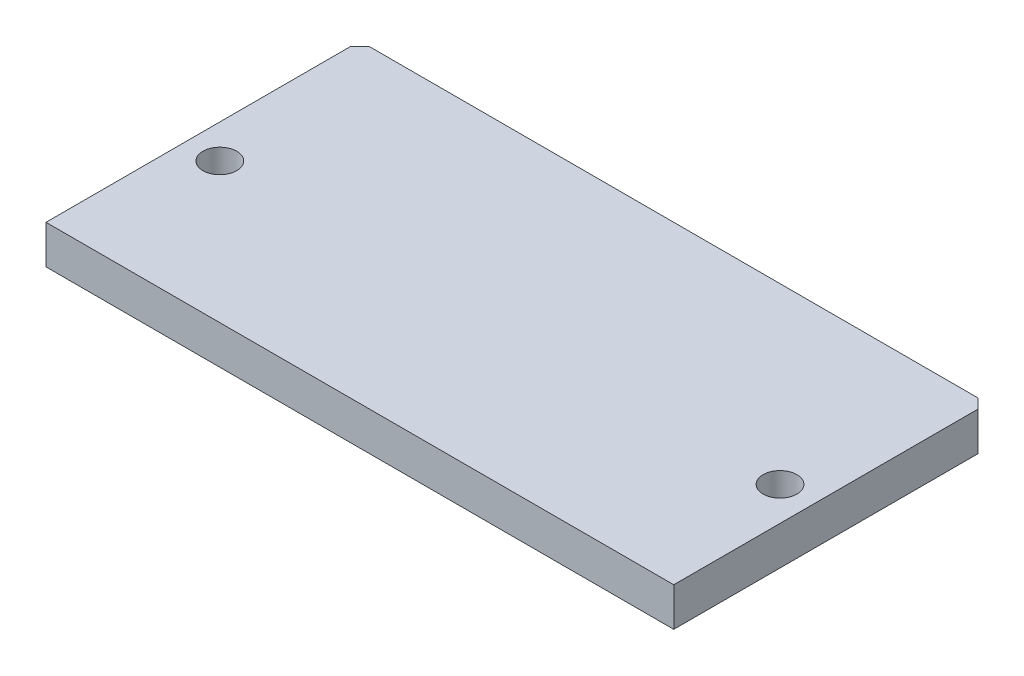
ISO-10303-21;
HEADER;
FILE_DESCRIPTION(('STEP AP214'),'2;1');
FILE_NAME('part.step','',(''),(''),'','','');
FILE_SCHEMA(('AUTOMOTIVE_DESIGN { 1 0 10303 214 1 1 1 1 }'));
ENDSEC;
DATA;
#1=APPLICATION_CONTEXT('core data for automotive mechanical design processes');
#2=APPLICATION_PROTOCOL_DEFINITION('international standard','automotive_design',2000,#1);
#3=PRODUCT_CONTEXT('',#1,'mechanical');
#4=PRODUCT('Part','Part','',(#3));
#5=PRODUCT_RELATED_PRODUCT_CATEGORY('part','',(#4));
#6=PRODUCT_DEFINITION_FORMATION('','',#4);
#7=PRODUCT_DEFINITION_CONTEXT('part definition',#1,'design');
#8=PRODUCT_DEFINITION('design','',#6,#7);
#9=PRODUCT_DEFINITION_SHAPE('','',#8);
#10=(LENGTH_UNIT() NAMED_UNIT(*) SI_UNIT(.MILLI.,.METRE.));
#11=(NAMED_UNIT(*) PLANE_ANGLE_UNIT() SI_UNIT($,.RADIAN.));
#12=(NAMED_UNIT(*) SI_UNIT($,.STERADIAN.) SOLID_ANGLE_UNIT());
#13=UNCERTAINTY_MEASURE_WITH_UNIT(LENGTH_MEASURE(1.E-05),#10,'distance_accuracy_value','');
#14=(GEOMETRIC_REPRESENTATION_CONTEXT(3) GLOBAL_UNCERTAINTY_ASSIGNED_CONTEXT((#13)) GLOBAL_UNIT_ASSIGNED_CONTEXT((#10,
#11,#12)) REPRESENTATION_CONTEXT('',''));
#15=CARTESIAN_POINT('',(0.,0.,0.));
#16=DIRECTION('',(0.,0.,1.));
#17=DIRECTION('',(1.,0.,0.));
#18=AXIS2_PLACEMENT_3D('',#15,#16,#17);
#19=CARTESIAN_POINT('',(31.5,4.,-16.25));
#20=DIRECTION('',(-0.70710678118655,0.,0.707106781186545));
#21=DIRECTION('',(0.,1.,0.));
#22=AXIS2_PLACEMENT_3D('',#19,#20,#21);
#23=PLANE('',#22);
#24=DIRECTION('',(-0.707106781186545,0.,-0.70710678118655));
#25=VECTOR('',#24,1.);
#26=CARTESIAN_POINT('',(23.875,4.,-23.875));
#27=LINE('',#26,#25);
#28=CARTESIAN_POINT('',(32.5,4.,-15.25));
#29=VERTEX_POINT('',#28);
#30=CARTESIAN_POINT('',(31.5,4.,-16.25));
#31=VERTEX_POINT('',#30);
#32=EDGE_CURVE('E101',#29,#31,#27,.T.);
#33=ORIENTED_EDGE('',*,*,#32,.F.);
#34=DIRECTION('',(0.,1.,0.));
#35=VECTOR('',#34,1.);
#36=CARTESIAN_POINT('',(32.5,4.,-15.25));
#37=LINE('',#36,#35);
#38=CARTESIAN_POINT('',(32.5,0.,-15.25));
#39=VERTEX_POINT('',#38);
#40=EDGE_CURVE('E128',#39,#29,#37,.T.);
#41=ORIENTED_EDGE('',*,*,#40,.F.);
#42=DIRECTION('',(0.707106781186545,0.,0.70710678118655));
#43=VECTOR('',#42,1.);
#44=CARTESIAN_POINT('',(31.5,0.,-16.25));
#45=LINE('',#44,#43);
#46=CARTESIAN_POINT('',(31.5,0.,-16.25));
#47=VERTEX_POINT('',#46);
#48=EDGE_CURVE('E90',#47,#39,#45,.T.);
#49=ORIENTED_EDGE('',*,*,#48,.F.);
#50=DIRECTION('',(0.,-1.,0.));
#51=VECTOR('',#50,1.);
#52=CARTESIAN_POINT('',(31.5,4.,-16.25));
#53=LINE('',#52,#51);
#54=EDGE_CURVE('E107',#31,#47,#53,.T.);
#55=ORIENTED_EDGE('',*,*,#54,.F.);
#56=EDGE_LOOP('',(#33,#41,#49,#55));
#57=FACE_BOUND('',#56,.T.);
#58=ADVANCED_FACE('F17',(#57),#23,.F.);
#59=CARTESIAN_POINT('',(-32.5,4.,-15.25));
#60=DIRECTION('',(0.70710678118655,0.,0.707106781186545));
#61=DIRECTION('',(0.,-1.,0.));
#62=AXIS2_PLACEMENT_3D('',#59,#60,#61);
#63=PLANE('',#62);
#64=DIRECTION('',(-0.707106781186545,0.,0.70710678118655));
#65=VECTOR('',#64,1.);
#66=CARTESIAN_POINT('',(-23.875,4.,-23.875));
#67=LINE('',#66,#65);
#68=CARTESIAN_POINT('',(-31.5,4.,-16.25));
#69=VERTEX_POINT('',#68);
#70=CARTESIAN_POINT('',(-32.5,4.,-15.25));
#71=VERTEX_POINT('',#70);
#72=EDGE_CURVE('E103',#69,#71,#67,.T.);
#73=ORIENTED_EDGE('',*,*,#72,.F.);
#74=DIRECTION('',(0.,1.,0.));
#75=VECTOR('',#74,1.);
#76=CARTESIAN_POINT('',(-31.5,4.,-16.25));
#77=LINE('',#76,#75);
#78=CARTESIAN_POINT('',(-31.5,0.,-16.25));
#79=VERTEX_POINT('',#78);
#80=EDGE_CURVE('E115',#79,#69,#77,.T.);
#81=ORIENTED_EDGE('',*,*,#80,.F.);
#82=DIRECTION('',(0.707106781186545,0.,-0.70710678118655));
#83=VECTOR('',#82,1.);
#84=CARTESIAN_POINT('',(-32.5,0.,-15.25));
#85=LINE('',#84,#83);
#86=CARTESIAN_POINT('',(-32.5,0.,-15.25));
#87=VERTEX_POINT('',#86);
#88=EDGE_CURVE('E95',#87,#79,#85,.T.);
#89=ORIENTED_EDGE('',*,*,#88,.F.);
#90=DIRECTION('',(0.,-1.,0.));
#91=VECTOR('',#90,1.);
#92=CARTESIAN_POINT('',(-32.5,4.,-15.25));
#93=LINE('',#92,#91);
#94=EDGE_CURVE('E154',#71,#87,#93,.T.);
#95=ORIENTED_EDGE('',*,*,#94,.F.);
#96=EDGE_LOOP('',(#73,#81,#89,#95));
#97=FACE_BOUND('',#96,.T.);
#98=ADVANCED_FACE('F19',(#97),#63,.F.);
#99=CARTESIAN_POINT('',(-29.,0.,1.75));
#100=DIRECTION('',(0.,-1.,0.));
#101=DIRECTION('',(0.,0.,-1.));
#102=AXIS2_PLACEMENT_3D('',#99,#100,#101);
#103=CONICAL_SURFACE('',#102,3.,0.785398163397448);
#104=CARTESIAN_POINT('',(-29.,1.24999999999999,1.75));
#105=DIRECTION('',(0.,-1.,0.));
#106=DIRECTION('',(0.,0.,-1.));
#107=AXIS2_PLACEMENT_3D('',#104,#105,#106);
#108=CIRCLE('',#107,1.75);
#109=CARTESIAN_POINT('',(-29.,1.24999999999999,0.));
#110=VERTEX_POINT('',#109);
#111=EDGE_CURVE('E11',#110,#110,#108,.T.);
#112=ORIENTED_EDGE('',*,*,#111,.F.);
#113=EDGE_LOOP('',(#112));
#114=FACE_BOUND('',#113,.T.);
#115=CARTESIAN_POINT('',(-29.,0.,1.75));
#116=DIRECTION('',(0.,-1.,0.));
#117=DIRECTION('',(0.,0.,-1.));
#118=AXIS2_PLACEMENT_3D('',#115,#116,#117);
#119=CIRCLE('',#118,3.);
#120=CARTESIAN_POINT('',(-29.,0.,-1.25));
#121=VERTEX_POINT('',#120);
#122=EDGE_CURVE('E83',#121,#121,#119,.T.);
#123=ORIENTED_EDGE('',*,*,#122,.T.);
#124=EDGE_LOOP('',(#123));
#125=FACE_BOUND('',#124,.T.);
#126=ADVANCED_FACE('F223',(#114,#125),#103,.F.);
#127=CARTESIAN_POINT('',(-29.,0.,1.75));
#128=DIRECTION('',(0.,-1.,0.));
#129=DIRECTION('',(0.,0.,-1.));
#130=AXIS2_PLACEMENT_3D('',#127,#128,#129);
#131=CYLINDRICAL_SURFACE('',#130,1.75);
#132=CARTESIAN_POINT('',(-29.,4.,1.75));
#133=DIRECTION('',(0.,1.,0.));
#134=DIRECTION('',(0.,0.,1.));
#135=AXIS2_PLACEMENT_3D('',#132,#133,#134);
#136=CIRCLE('',#135,1.75);
#137=CARTESIAN_POINT('',(-29.,4.,3.5));
#138=VERTEX_POINT('',#137);
#139=EDGE_CURVE('E99',#138,#138,#136,.T.);
#140=ORIENTED_EDGE('',*,*,#139,.T.);
#141=EDGE_LOOP('',(#140));
#142=FACE_BOUND('',#141,.T.);
#143=ORIENTED_EDGE('',*,*,#111,.T.);
#144=EDGE_LOOP('',(#143));
#145=FACE_BOUND('',#144,.T.);
#146=ADVANCED_FACE('F230',(#142,#145),#131,.F.);
#147=CARTESIAN_POINT('',(29.,0.,1.75));
#148=DIRECTION('',(0.,-1.,0.));
#149=DIRECTION('',(0.,0.,-1.));
#150=AXIS2_PLACEMENT_3D('',#147,#148,#149);
#151=CONICAL_SURFACE('',#150,3.,0.785398163397448);
#152=CARTESIAN_POINT('',(29.,1.24999999999999,1.75));
#153=DIRECTION('',(0.,-1.,0.));
#154=DIRECTION('',(0.,0.,-1.));
#155=AXIS2_PLACEMENT_3D('',#152,#153,#154);
#156=CIRCLE('',#155,1.75);
#157=CARTESIAN_POINT('',(29.,1.24999999999999,0.));
#158=VERTEX_POINT('',#157);
#159=EDGE_CURVE('E27',#158,#158,#156,.T.);
#160=ORIENTED_EDGE('',*,*,#159,.F.);
#161=EDGE_LOOP('',(#160));
#162=FACE_BOUND('',#161,.T.);
#163=CARTESIAN_POINT('',(29.,0.,1.75));
#164=DIRECTION('',(0.,-1.,0.));
#165=DIRECTION('',(0.,0.,-1.));
#166=AXIS2_PLACEMENT_3D('',#163,#164,#165);
#167=CIRCLE('',#166,3.);
#168=CARTESIAN_POINT('',(29.,0.,-1.24999999999998));
#169=VERTEX_POINT('',#168);
#170=EDGE_CURVE('E79',#169,#169,#167,.T.);
#171=ORIENTED_EDGE('',*,*,#170,.T.);
#172=EDGE_LOOP('',(#171));
#173=FACE_BOUND('',#172,.T.);
#174=ADVANCED_FACE('F80',(#162,#173),#151,.F.);
#175=CARTESIAN_POINT('',(29.,0.,1.75));
#176=DIRECTION('',(0.,-1.,0.));
#177=DIRECTION('',(0.,0.,-1.));
#178=AXIS2_PLACEMENT_3D('',#175,#176,#177);
#179=CYLINDRICAL_SURFACE('',#178,1.75);
#180=CARTESIAN_POINT('',(29.,4.,1.75));
#181=DIRECTION('',(0.,1.,0.));
#182=DIRECTION('',(0.,0.,1.));
#183=AXIS2_PLACEMENT_3D('',#180,#181,#182);
#184=CIRCLE('',#183,1.75);
#185=CARTESIAN_POINT('',(29.,4.,3.5));
#186=VERTEX_POINT('',#185);
#187=EDGE_CURVE('E96',#186,#186,#184,.T.);
#188=ORIENTED_EDGE('',*,*,#187,.T.);
#189=EDGE_LOOP('',(#188));
#190=FACE_BOUND('',#189,.T.);
#191=ORIENTED_EDGE('',*,*,#159,.T.);
#192=EDGE_LOOP('',(#191));
#193=FACE_BOUND('',#192,.T.);
#194=ADVANCED_FACE('F237',(#190,#193),#179,.F.);
#195=CARTESIAN_POINT('',(0.,0.,0.));
#196=DIRECTION('',(0.,1.,0.));
#197=DIRECTION('',(1.,0.,0.));
#198=AXIS2_PLACEMENT_3D('',#195,#196,#197);
#199=PLANE('',#198);
#200=ORIENTED_EDGE('',*,*,#170,.F.);
#201=EDGE_LOOP('',(#200));
#202=FACE_BOUND('',#201,.T.);
#203=ORIENTED_EDGE('',*,*,#122,.F.);
#204=EDGE_LOOP('',(#203));
#205=FACE_BOUND('',#204,.T.);
#206=DIRECTION('',(0.,0.,1.));
#207=VECTOR('',#206,1.);
#208=CARTESIAN_POINT('',(-32.5,0.,16.25));
#209=LINE('',#208,#207);
#210=CARTESIAN_POINT('',(-32.5,0.,16.25));
#211=VERTEX_POINT('',#210);
#212=EDGE_CURVE('E150',#87,#211,#209,.T.);
#213=ORIENTED_EDGE('',*,*,#212,.F.);
#214=ORIENTED_EDGE('',*,*,#88,.T.);
#215=DIRECTION('',(-1.,0.,0.));
#216=VECTOR('',#215,1.);
#217=CARTESIAN_POINT('',(32.5,0.,-16.25));
#218=LINE('',#217,#216);
#219=EDGE_CURVE('E116',#47,#79,#218,.T.);
#220=ORIENTED_EDGE('',*,*,#219,.F.);
#221=ORIENTED_EDGE('',*,*,#48,.T.);
#222=DIRECTION('',(0.,0.,-1.));
#223=VECTOR('',#222,1.);
#224=CARTESIAN_POINT('',(32.5,0.,16.25));
#225=LINE('',#224,#223);
#226=CARTESIAN_POINT('',(32.5,0.,16.25));
#227=VERTEX_POINT('',#226);
#228=EDGE_CURVE('E124',#227,#39,#225,.T.);
#229=ORIENTED_EDGE('',*,*,#228,.F.);
#230=DIRECTION('',(1.,0.,0.));
#231=VECTOR('',#230,1.);
#232=CARTESIAN_POINT('',(32.5,0.,16.25));
#233=LINE('',#232,#231);
#234=EDGE_CURVE('E140',#211,#227,#233,.T.);
#235=ORIENTED_EDGE('',*,*,#234,.F.);
#236=EDGE_LOOP('',(#213,#214,#220,#221,#229,#235));
#237=FACE_BOUND('',#236,.T.);
#238=ADVANCED_FACE('F209',(#202,#205,#237),#199,.F.);
#239=CARTESIAN_POINT('',(0.,4.,0.));
#240=DIRECTION('',(0.,1.,0.));
#241=DIRECTION('',(1.,0.,0.));
#242=AXIS2_PLACEMENT_3D('',#239,#240,#241);
#243=PLANE('',#242);
#244=ORIENTED_EDGE('',*,*,#187,.F.);
#245=EDGE_LOOP('',(#244));
#246=FACE_BOUND('',#245,.T.);
#247=ORIENTED_EDGE('',*,*,#139,.F.);
#248=EDGE_LOOP('',(#247));
#249=FACE_BOUND('',#248,.T.);
#250=DIRECTION('',(-1.,0.,0.));
#251=VECTOR('',#250,1.);
#252=CARTESIAN_POINT('',(32.5,4.,-16.25));
#253=LINE('',#252,#251);
#254=EDGE_CURVE('E111',#31,#69,#253,.T.);
#255=ORIENTED_EDGE('',*,*,#254,.T.);
#256=ORIENTED_EDGE('',*,*,#72,.T.);
#257=DIRECTION('',(0.,0.,1.));
#258=VECTOR('',#257,1.);
#259=CARTESIAN_POINT('',(-32.5,4.,16.25));
#260=LINE('',#259,#258);
#261=CARTESIAN_POINT('',(-32.5,4.,16.25));
#262=VERTEX_POINT('',#261);
#263=EDGE_CURVE('E161',#71,#262,#260,.T.);
#264=ORIENTED_EDGE('',*,*,#263,.T.);
#265=DIRECTION('',(1.,0.,0.));
#266=VECTOR('',#265,1.);
#267=CARTESIAN_POINT('',(32.5,4.,16.25));
#268=LINE('',#267,#266);
#269=CARTESIAN_POINT('',(32.5,4.,16.25));
#270=VERTEX_POINT('',#269);
#271=EDGE_CURVE('E129',#262,#270,#268,.T.);
#272=ORIENTED_EDGE('',*,*,#271,.T.);
#273=DIRECTION('',(0.,0.,-1.));
#274=VECTOR('',#273,1.);
#275=CARTESIAN_POINT('',(32.5,4.,16.25));
#276=LINE('',#275,#274);
#277=EDGE_CURVE('E120',#270,#29,#276,.T.);
#278=ORIENTED_EDGE('',*,*,#277,.T.);
#279=ORIENTED_EDGE('',*,*,#32,.T.);
#280=EDGE_LOOP('',(#255,#256,#264,#272,#278,#279));
#281=FACE_BOUND('',#280,.T.);
#282=ADVANCED_FACE('F171',(#246,#249,#281),#243,.T.);
#283=CARTESIAN_POINT('',(32.5,4.,-16.25));
#284=DIRECTION('',(0.,0.,1.));
#285=DIRECTION('',(1.,0.,0.));
#286=AXIS2_PLACEMENT_3D('',#283,#284,#285);
#287=PLANE('',#286);
#288=ORIENTED_EDGE('',*,*,#219,.T.);
#289=ORIENTED_EDGE('',*,*,#80,.T.);
#290=ORIENTED_EDGE('',*,*,#254,.F.);
#291=ORIENTED_EDGE('',*,*,#54,.T.);
#292=EDGE_LOOP('',(#288,#289,#290,#291));
#293=FACE_BOUND('',#292,.T.);
#294=ADVANCED_FACE('F221',(#293),#287,.F.);
#295=CARTESIAN_POINT('',(32.5,4.,16.25));
#296=DIRECTION('',(-1.,0.,0.));
#297=DIRECTION('',(0.,0.,1.));
#298=AXIS2_PLACEMENT_3D('',#295,#296,#297);
#299=PLANE('',#298);
#300=ORIENTED_EDGE('',*,*,#228,.T.);
#301=ORIENTED_EDGE('',*,*,#40,.T.);
#302=ORIENTED_EDGE('',*,*,#277,.F.);
#303=DIRECTION('',(0.,-1.,0.));
#304=VECTOR('',#303,1.);
#305=CARTESIAN_POINT('',(32.5,4.,16.25));
#306=LINE('',#305,#304);
#307=EDGE_CURVE('E136',#270,#227,#306,.T.);
#308=ORIENTED_EDGE('',*,*,#307,.T.);
#309=EDGE_LOOP('',(#300,#301,#302,#308));
#310=FACE_BOUND('',#309,.T.);
#311=ADVANCED_FACE('F214',(#310),#299,.F.);
#312=CARTESIAN_POINT('',(32.5,4.,16.25));
#313=DIRECTION('',(0.,0.,-1.));
#314=DIRECTION('',(-1.,0.,0.));
#315=AXIS2_PLACEMENT_3D('',#312,#313,#314);
#316=PLANE('',#315);
#317=ORIENTED_EDGE('',*,*,#234,.T.);
#318=ORIENTED_EDGE('',*,*,#307,.F.);
#319=ORIENTED_EDGE('',*,*,#271,.F.);
#320=DIRECTION('',(0.,-1.,0.));
#321=VECTOR('',#320,1.);
#322=CARTESIAN_POINT('',(-32.5,4.,16.25));
#323=LINE('',#322,#321);
#324=EDGE_CURVE('E144',#262,#211,#323,.T.);
#325=ORIENTED_EDGE('',*,*,#324,.T.);
#326=EDGE_LOOP('',(#317,#318,#319,#325));
#327=FACE_BOUND('',#326,.T.);
#328=ADVANCED_FACE('F211',(#327),#316,.F.);
#329=CARTESIAN_POINT('',(-32.5,4.,16.25));
#330=DIRECTION('',(1.,0.,0.));
#331=DIRECTION('',(0.,1.,0.));
#332=AXIS2_PLACEMENT_3D('',#329,#330,#331);
#333=PLANE('',#332);
#334=ORIENTED_EDGE('',*,*,#263,.F.);
#335=ORIENTED_EDGE('',*,*,#94,.T.);
#336=ORIENTED_EDGE('',*,*,#212,.T.);
#337=ORIENTED_EDGE('',*,*,#324,.F.);
#338=EDGE_LOOP('',(#334,#335,#336,#337));
#339=FACE_BOUND('',#338,.T.);
#340=ADVANCED_FACE('F181',(#339),#333,.F.);
#341=CLOSED_SHELL('',(#58,#98,#126,#146,#174,#194,#238,#282,#294,#311,#328,#340));
#342=MANIFOLD_SOLID_BREP('B1',#341);
#343=ADVANCED_BREP_SHAPE_REPRESENTATION('',(#18,#342),#14);
#344=SHAPE_DEFINITION_REPRESENTATION(#9,#343);
ENDSEC;
END-ISO-10303-21;
